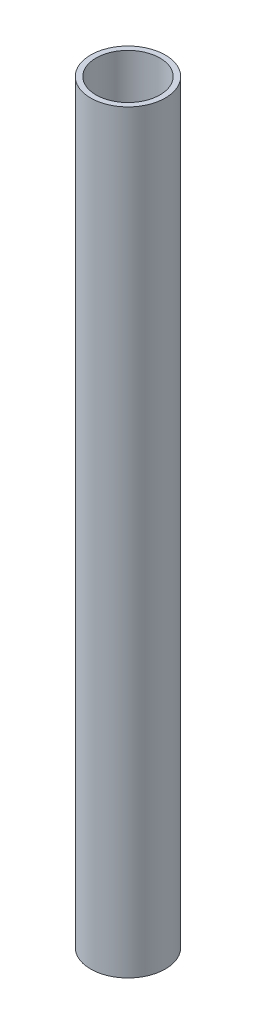
ISO-10303-21;
HEADER;
FILE_DESCRIPTION(('STEP AP214'),'2;1');
FILE_NAME('part.step','',(''),(''),'','','');
FILE_SCHEMA(('AUTOMOTIVE_DESIGN { 1 0 10303 214 1 1 1 1 }'));
ENDSEC;
DATA;
#1=APPLICATION_CONTEXT('core data for automotive mechanical design processes');
#2=APPLICATION_PROTOCOL_DEFINITION('international standard','automotive_design',2000,#1);
#3=PRODUCT_CONTEXT('',#1,'mechanical');
#4=PRODUCT('Part','Part','',(#3));
#5=PRODUCT_RELATED_PRODUCT_CATEGORY('part','',(#4));
#6=PRODUCT_DEFINITION_FORMATION('','',#4);
#7=PRODUCT_DEFINITION_CONTEXT('part definition',#1,'design');
#8=PRODUCT_DEFINITION('design','',#6,#7);
#9=PRODUCT_DEFINITION_SHAPE('','',#8);
#10=(LENGTH_UNIT() NAMED_UNIT(*) SI_UNIT(.MILLI.,.METRE.));
#11=(NAMED_UNIT(*) PLANE_ANGLE_UNIT() SI_UNIT($,.RADIAN.));
#12=(NAMED_UNIT(*) SI_UNIT($,.STERADIAN.) SOLID_ANGLE_UNIT());
#13=UNCERTAINTY_MEASURE_WITH_UNIT(LENGTH_MEASURE(1.E-05),#10,'distance_accuracy_value','');
#14=(GEOMETRIC_REPRESENTATION_CONTEXT(3) GLOBAL_UNCERTAINTY_ASSIGNED_CONTEXT((#13)) GLOBAL_UNIT_ASSIGNED_CONTEXT((#10,
#11,#12)) REPRESENTATION_CONTEXT('',''));
#15=CARTESIAN_POINT('',(0.,0.,0.));
#16=DIRECTION('',(0.,0.,1.));
#17=DIRECTION('',(1.,0.,0.));
#18=AXIS2_PLACEMENT_3D('',#15,#16,#17);
#19=CARTESIAN_POINT('',(0.,283.,0.));
#20=DIRECTION('',(0.,1.,0.));
#21=DIRECTION('',(0.,0.,1.));
#22=AXIS2_PLACEMENT_3D('',#19,#20,#21);
#23=PLANE('',#22);
#24=CARTESIAN_POINT('',(0.,283.,0.));
#25=DIRECTION('',(0.,1.,0.));
#26=DIRECTION('',(0.,0.,1.));
#27=AXIS2_PLACEMENT_3D('',#24,#25,#26);
#28=CIRCLE('',#27,14.);
#29=CARTESIAN_POINT('',(0.,283.,14.));
#30=VERTEX_POINT('',#29);
#31=EDGE_CURVE('E10',#30,#30,#28,.T.);
#32=ORIENTED_EDGE('',*,*,#31,.T.);
#33=EDGE_LOOP('',(#32));
#34=FACE_BOUND('',#33,.T.);
#35=CARTESIAN_POINT('',(0.,283.,0.));
#36=DIRECTION('',(0.,1.,0.));
#37=DIRECTION('',(0.,0.,1.));
#38=AXIS2_PLACEMENT_3D('',#35,#36,#37);
#39=CIRCLE('',#38,12.);
#40=CARTESIAN_POINT('',(0.,283.,12.));
#41=VERTEX_POINT('',#40);
#42=EDGE_CURVE('E42',#41,#41,#39,.T.);
#43=ORIENTED_EDGE('',*,*,#42,.F.);
#44=EDGE_LOOP('',(#43));
#45=FACE_BOUND('',#44,.T.);
#46=ADVANCED_FACE('F31',(#34,#45),#23,.T.);
#47=CARTESIAN_POINT('',(0.,0.,0.));
#48=DIRECTION('',(0.,1.,0.));
#49=DIRECTION('',(0.,0.,1.));
#50=AXIS2_PLACEMENT_3D('',#47,#48,#49);
#51=PLANE('',#50);
#52=CARTESIAN_POINT('',(0.,0.,0.));
#53=DIRECTION('',(0.,1.,0.));
#54=DIRECTION('',(0.,0.,1.));
#55=AXIS2_PLACEMENT_3D('',#52,#53,#54);
#56=CIRCLE('',#55,14.);
#57=CARTESIAN_POINT('',(0.,0.,14.));
#58=VERTEX_POINT('',#57);
#59=EDGE_CURVE('E35',#58,#58,#56,.T.);
#60=ORIENTED_EDGE('',*,*,#59,.F.);
#61=EDGE_LOOP('',(#60));
#62=FACE_BOUND('',#61,.T.);
#63=CARTESIAN_POINT('',(0.,0.,0.));
#64=DIRECTION('',(0.,1.,0.));
#65=DIRECTION('',(0.,0.,1.));
#66=AXIS2_PLACEMENT_3D('',#63,#64,#65);
#67=CIRCLE('',#66,12.);
#68=CARTESIAN_POINT('',(0.,0.,12.));
#69=VERTEX_POINT('',#68);
#70=EDGE_CURVE('E44',#69,#69,#67,.T.);
#71=ORIENTED_EDGE('',*,*,#70,.T.);
#72=EDGE_LOOP('',(#71));
#73=FACE_BOUND('',#72,.T.);
#74=ADVANCED_FACE('F54',(#62,#73),#51,.F.);
#75=CARTESIAN_POINT('',(0.,283.,0.));
#76=DIRECTION('',(0.,-1.,0.));
#77=DIRECTION('',(0.,0.,-1.));
#78=AXIS2_PLACEMENT_3D('',#75,#76,#77);
#79=CYLINDRICAL_SURFACE('',#78,14.);
#80=ORIENTED_EDGE('',*,*,#31,.F.);
#81=EDGE_LOOP('',(#80));
#82=FACE_BOUND('',#81,.T.);
#83=ORIENTED_EDGE('',*,*,#59,.T.);
#84=EDGE_LOOP('',(#83));
#85=FACE_BOUND('',#84,.T.);
#86=ADVANCED_FACE('F33',(#82,#85),#79,.T.);
#87=CARTESIAN_POINT('',(0.,283.,0.));
#88=DIRECTION('',(0.,-1.,0.));
#89=DIRECTION('',(0.,0.,-1.));
#90=AXIS2_PLACEMENT_3D('',#87,#88,#89);
#91=CYLINDRICAL_SURFACE('',#90,12.);
#92=ORIENTED_EDGE('',*,*,#42,.T.);
#93=EDGE_LOOP('',(#92));
#94=FACE_BOUND('',#93,.T.);
#95=ORIENTED_EDGE('',*,*,#70,.F.);
#96=EDGE_LOOP('',(#95));
#97=FACE_BOUND('',#96,.T.);
#98=ADVANCED_FACE('F50',(#94,#97),#91,.F.);
#99=CLOSED_SHELL('',(#46,#74,#86,#98));
#100=MANIFOLD_SOLID_BREP('B2',#99);
#101=ADVANCED_BREP_SHAPE_REPRESENTATION('',(#18,#100),#14);
#102=SHAPE_DEFINITION_REPRESENTATION(#9,#101);
ENDSEC;
END-ISO-10303-21;
